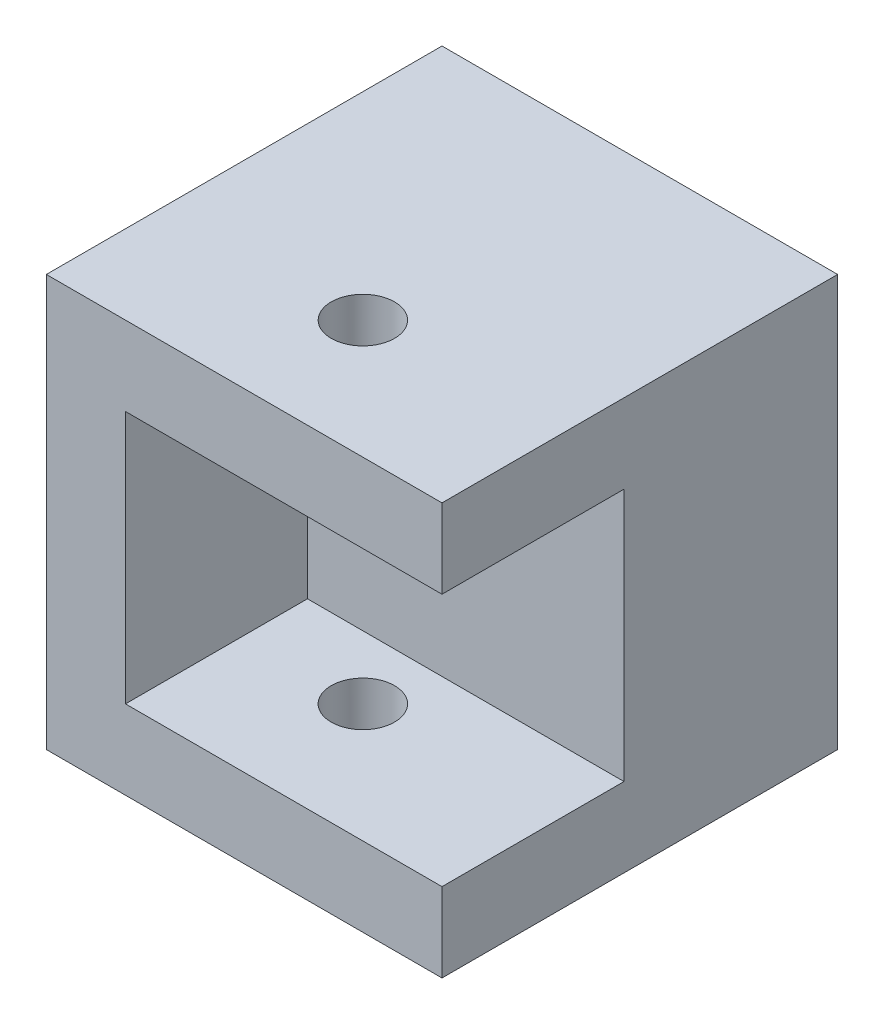
ISO-10303-21;
HEADER;
FILE_DESCRIPTION(('STEP AP214'),'2;1');
FILE_NAME('part.step','',(''),(''),'','','');
FILE_SCHEMA(('AUTOMOTIVE_DESIGN { 1 0 10303 214 1 1 1 1 }'));
ENDSEC;
DATA;
#1=APPLICATION_CONTEXT('core data for automotive mechanical design processes');
#2=APPLICATION_PROTOCOL_DEFINITION('international standard','automotive_design',2000,#1);
#3=PRODUCT_CONTEXT('',#1,'mechanical');
#4=PRODUCT('Part','Part','',(#3));
#5=PRODUCT_RELATED_PRODUCT_CATEGORY('part','',(#4));
#6=PRODUCT_DEFINITION_FORMATION('','',#4);
#7=PRODUCT_DEFINITION_CONTEXT('part definition',#1,'design');
#8=PRODUCT_DEFINITION('design','',#6,#7);
#9=PRODUCT_DEFINITION_SHAPE('','',#8);
#10=(LENGTH_UNIT() NAMED_UNIT(*) SI_UNIT(.MILLI.,.METRE.));
#11=(NAMED_UNIT(*) PLANE_ANGLE_UNIT() SI_UNIT($,.RADIAN.));
#12=(NAMED_UNIT(*) SI_UNIT($,.STERADIAN.) SOLID_ANGLE_UNIT());
#13=UNCERTAINTY_MEASURE_WITH_UNIT(LENGTH_MEASURE(1.E-05),#10,'distance_accuracy_value','');
#14=(GEOMETRIC_REPRESENTATION_CONTEXT(3) GLOBAL_UNCERTAINTY_ASSIGNED_CONTEXT((#13)) GLOBAL_UNIT_ASSIGNED_CONTEXT((#10,
#11,#12)) REPRESENTATION_CONTEXT('',''));
#15=CARTESIAN_POINT('',(0.,0.,0.));
#16=DIRECTION('',(0.,0.,1.));
#17=DIRECTION('',(1.,0.,0.));
#18=AXIS2_PLACEMENT_3D('',#15,#16,#17);
#19=CARTESIAN_POINT('',(7.70034407151723,28.7604472929724,21.5));
#20=DIRECTION('',(0.,-1.,0.));
#21=DIRECTION('',(1.,0.,0.));
#22=AXIS2_PLACEMENT_3D('',#19,#20,#21);
#23=CYLINDRICAL_SURFACE('',#22,2.);
#24=CARTESIAN_POINT('',(7.70034407151723,19.7604472929724,21.5));
#25=DIRECTION('',(0.,-1.,0.));
#26=DIRECTION('',(0.,0.,-1.));
#27=AXIS2_PLACEMENT_3D('',#24,#25,#26);
#28=CIRCLE('',#27,2.);
#29=CARTESIAN_POINT('',(7.70034407151723,19.7604472929724,19.5));
#30=VERTEX_POINT('',#29);
#31=EDGE_CURVE('E208',#30,#30,#28,.T.);
#32=ORIENTED_EDGE('',*,*,#31,.F.);
#33=EDGE_LOOP('',(#32));
#34=FACE_BOUND('',#33,.T.);
#35=CARTESIAN_POINT('',(7.70034407151723,14.7604472929724,21.5));
#36=DIRECTION('',(0.,-1.,0.));
#37=DIRECTION('',(1.,0.,0.));
#38=AXIS2_PLACEMENT_3D('',#35,#36,#37);
#39=CIRCLE('',#38,2.);
#40=CARTESIAN_POINT('',(9.70034407151723,14.7604472929724,21.5));
#41=VERTEX_POINT('',#40);
#42=EDGE_CURVE('E140',#41,#41,#39,.F.);
#43=ORIENTED_EDGE('',*,*,#42,.F.);
#44=EDGE_LOOP('',(#43));
#45=FACE_BOUND('',#44,.T.);
#46=ADVANCED_FACE('F44',(#34,#45),#23,.F.);
#47=CARTESIAN_POINT('',(-4.79965592848278,19.7604472929724,25.));
#48=DIRECTION('',(0.,-1.,0.));
#49=DIRECTION('',(0.,0.,-1.));
#50=AXIS2_PLACEMENT_3D('',#47,#48,#49);
#51=PLANE('',#50);
#52=ORIENTED_EDGE('',*,*,#31,.T.);
#53=EDGE_LOOP('',(#52));
#54=FACE_BOUND('',#53,.T.);
#55=DIRECTION('',(1.,0.,0.));
#56=VECTOR('',#55,1.);
#57=CARTESIAN_POINT('',(-31.1055488044146,19.7604472929724,3.99999999999998));
#58=LINE('',#57,#56);
#59=CARTESIAN_POINT('',(-4.79965592848278,19.7604472929724,3.99999999999998));
#60=VERTEX_POINT('',#59);
#61=CARTESIAN_POINT('',(20.2003440715172,19.7604472929724,3.99999999999998));
#62=VERTEX_POINT('',#61);
#63=EDGE_CURVE('E201',#60,#62,#58,.T.);
#64=ORIENTED_EDGE('',*,*,#63,.F.);
#65=DIRECTION('',(0.,0.,-1.));
#66=VECTOR('',#65,1.);
#67=CARTESIAN_POINT('',(-4.79965592848278,19.7604472929724,25.));
#68=LINE('',#67,#66);
#69=CARTESIAN_POINT('',(-4.79965592848278,19.7604472929724,29.));
#70=VERTEX_POINT('',#69);
#71=EDGE_CURVE('E13',#70,#60,#68,.T.);
#72=ORIENTED_EDGE('',*,*,#71,.F.);
#73=DIRECTION('',(-1.,0.,0.));
#74=VECTOR('',#73,1.);
#75=CARTESIAN_POINT('',(15.2003440715172,19.7604472929724,29.));
#76=LINE('',#75,#74);
#77=CARTESIAN_POINT('',(20.2003440715172,19.7604472929724,29.));
#78=VERTEX_POINT('',#77);
#79=EDGE_CURVE('E121',#78,#70,#76,.T.);
#80=ORIENTED_EDGE('',*,*,#79,.F.);
#81=DIRECTION('',(0.,0.,1.));
#82=VECTOR('',#81,1.);
#83=CARTESIAN_POINT('',(20.2003440715172,19.7604472929724,3.99999999999998));
#84=LINE('',#83,#82);
#85=EDGE_CURVE('E182',#62,#78,#84,.T.);
#86=ORIENTED_EDGE('',*,*,#85,.F.);
#87=EDGE_LOOP('',(#64,#72,#80,#86));
#88=FACE_BOUND('',#87,.T.);
#89=ADVANCED_FACE('F46',(#54,#88),#51,.F.);
#90=CARTESIAN_POINT('',(-4.79965592848278,-6.23955270702758,25.));
#91=DIRECTION('',(1.,0.,0.));
#92=DIRECTION('',(0.,1.,0.));
#93=AXIS2_PLACEMENT_3D('',#90,#91,#92);
#94=PLANE('',#93);
#95=DIRECTION('',(0.,-1.,0.));
#96=VECTOR('',#95,1.);
#97=CARTESIAN_POINT('',(-4.79965592848278,0.,4.));
#98=LINE('',#97,#96);
#99=CARTESIAN_POINT('',(-4.79965592848278,-6.2395527070276,3.99999999999998));
#100=VERTEX_POINT('',#99);
#101=EDGE_CURVE('E198',#60,#100,#98,.T.);
#102=ORIENTED_EDGE('',*,*,#101,.T.);
#103=DIRECTION('',(0.,0.,-1.));
#104=VECTOR('',#103,1.);
#105=CARTESIAN_POINT('',(-4.79965592848278,-6.23955270702758,25.));
#106=LINE('',#105,#104);
#107=CARTESIAN_POINT('',(-4.79965592848278,-6.23955270702758,29.));
#108=VERTEX_POINT('',#107);
#109=EDGE_CURVE('E52',#108,#100,#106,.T.);
#110=ORIENTED_EDGE('',*,*,#109,.F.);
#111=DIRECTION('',(0.,-1.,0.));
#112=VECTOR('',#111,1.);
#113=CARTESIAN_POINT('',(-4.79965592848278,19.7604472929724,29.));
#114=LINE('',#113,#112);
#115=EDGE_CURVE('E193',#70,#108,#114,.T.);
#116=ORIENTED_EDGE('',*,*,#115,.F.);
#117=ORIENTED_EDGE('',*,*,#71,.T.);
#118=EDGE_LOOP('',(#102,#110,#116,#117));
#119=FACE_BOUND('',#118,.T.);
#120=ADVANCED_FACE('F217',(#119),#94,.F.);
#121=CARTESIAN_POINT('',(-4.79965592848278,-6.23955270702758,25.));
#122=DIRECTION('',(0.,1.,0.));
#123=DIRECTION('',(0.,0.,1.));
#124=AXIS2_PLACEMENT_3D('',#121,#122,#123);
#125=PLANE('',#124);
#126=CARTESIAN_POINT('',(7.70034407151723,-6.23955270702758,21.5));
#127=DIRECTION('',(0.,1.,0.));
#128=DIRECTION('',(0.,0.,1.));
#129=AXIS2_PLACEMENT_3D('',#126,#127,#128);
#130=CIRCLE('',#129,2.);
#131=CARTESIAN_POINT('',(7.70034407151723,-6.23955270702758,23.5));
#132=VERTEX_POINT('',#131);
#133=EDGE_CURVE('E122',#132,#132,#130,.T.);
#134=ORIENTED_EDGE('',*,*,#133,.T.);
#135=EDGE_LOOP('',(#134));
#136=FACE_BOUND('',#135,.T.);
#137=DIRECTION('',(1.,0.,0.));
#138=VECTOR('',#137,1.);
#139=CARTESIAN_POINT('',(-31.1055488044146,-6.2395527070276,3.99999999999998));
#140=LINE('',#139,#138);
#141=CARTESIAN_POINT('',(20.2003440715172,-6.2395527070276,3.99999999999998));
#142=VERTEX_POINT('',#141);
#143=EDGE_CURVE('E67',#100,#142,#140,.T.);
#144=ORIENTED_EDGE('',*,*,#143,.T.);
#145=DIRECTION('',(0.,0.,-1.));
#146=VECTOR('',#145,1.);
#147=CARTESIAN_POINT('',(20.2003440715172,-6.23955270702758,29.));
#148=LINE('',#147,#146);
#149=CARTESIAN_POINT('',(20.2003440715172,-6.23955270702758,29.));
#150=VERTEX_POINT('',#149);
#151=EDGE_CURVE('E176',#150,#142,#148,.T.);
#152=ORIENTED_EDGE('',*,*,#151,.F.);
#153=DIRECTION('',(1.,0.,0.));
#154=VECTOR('',#153,1.);
#155=CARTESIAN_POINT('',(0.200344071517228,-6.23955270702758,29.));
#156=LINE('',#155,#154);
#157=EDGE_CURVE('E200',#108,#150,#156,.T.);
#158=ORIENTED_EDGE('',*,*,#157,.F.);
#159=ORIENTED_EDGE('',*,*,#109,.T.);
#160=EDGE_LOOP('',(#144,#152,#158,#159));
#161=FACE_BOUND('',#160,.T.);
#162=ADVANCED_FACE('F213',(#136,#161),#125,.F.);
#163=CARTESIAN_POINT('',(0.200344071517226,13.7604472929724,25.));
#164=DIRECTION('',(-1.,0.,0.));
#165=DIRECTION('',(0.,0.,1.));
#166=AXIS2_PLACEMENT_3D('',#163,#164,#165);
#167=PLANE('',#166);
#168=DIRECTION('',(0.,0.,-1.));
#169=VECTOR('',#168,1.);
#170=CARTESIAN_POINT('',(0.200344071517228,-1.23955270702759,29.));
#171=LINE('',#170,#169);
#172=CARTESIAN_POINT('',(0.200344071517228,-1.23955270702759,29.));
#173=VERTEX_POINT('',#172);
#174=CARTESIAN_POINT('',(0.200344071517228,-1.23955270702759,17.5));
#175=VERTEX_POINT('',#174);
#176=EDGE_CURVE('E206',#173,#175,#171,.T.);
#177=ORIENTED_EDGE('',*,*,#176,.T.);
#178=DIRECTION('',(0.,-1.,0.));
#179=VECTOR('',#178,1.);
#180=CARTESIAN_POINT('',(0.200344071517226,13.7604472929724,17.5));
#181=LINE('',#180,#179);
#182=CARTESIAN_POINT('',(0.200344071517228,14.7604472929724,17.5));
#183=VERTEX_POINT('',#182);
#184=EDGE_CURVE('E128',#183,#175,#181,.T.);
#185=ORIENTED_EDGE('',*,*,#184,.F.);
#186=DIRECTION('',(0.,0.,-1.));
#187=VECTOR('',#186,1.);
#188=CARTESIAN_POINT('',(0.200344071517228,14.7604472929724,29.));
#189=LINE('',#188,#187);
#190=CARTESIAN_POINT('',(0.200344071517228,14.7604472929724,29.));
#191=VERTEX_POINT('',#190);
#192=EDGE_CURVE('E125',#191,#183,#189,.T.);
#193=ORIENTED_EDGE('',*,*,#192,.F.);
#194=DIRECTION('',(0.,1.,0.));
#195=VECTOR('',#194,1.);
#196=CARTESIAN_POINT('',(0.200344071517228,-1.23955270702759,29.));
#197=LINE('',#196,#195);
#198=EDGE_CURVE('E110',#173,#191,#197,.T.);
#199=ORIENTED_EDGE('',*,*,#198,.F.);
#200=EDGE_LOOP('',(#177,#185,#193,#199));
#201=FACE_BOUND('',#200,.T.);
#202=ADVANCED_FACE('F126',(#201),#167,.F.);
#203=CARTESIAN_POINT('',(15.2003440715172,-1.23955270702759,29.));
#204=DIRECTION('',(0.,-1.,0.));
#205=DIRECTION('',(1.,0.,0.));
#206=AXIS2_PLACEMENT_3D('',#203,#204,#205);
#207=PLANE('',#206);
#208=CARTESIAN_POINT('',(7.70034407151723,-1.23955270702759,21.5));
#209=DIRECTION('',(0.,1.,0.));
#210=DIRECTION('',(-1.,0.,0.));
#211=AXIS2_PLACEMENT_3D('',#208,#209,#210);
#212=CIRCLE('',#211,2.);
#213=CARTESIAN_POINT('',(5.70034407151723,-1.23955270702759,21.5));
#214=VERTEX_POINT('',#213);
#215=EDGE_CURVE('E188',#214,#214,#212,.T.);
#216=ORIENTED_EDGE('',*,*,#215,.F.);
#217=EDGE_LOOP('',(#216));
#218=FACE_BOUND('',#217,.T.);
#219=DIRECTION('',(-1.,0.,0.));
#220=VECTOR('',#219,1.);
#221=CARTESIAN_POINT('',(15.2003440715172,-1.23955270702759,29.));
#222=LINE('',#221,#220);
#223=CARTESIAN_POINT('',(20.2003440715172,-1.23955270702759,29.));
#224=VERTEX_POINT('',#223);
#225=EDGE_CURVE('E118',#224,#173,#222,.T.);
#226=ORIENTED_EDGE('',*,*,#225,.F.);
#227=DIRECTION('',(0.,0.,1.));
#228=VECTOR('',#227,1.);
#229=CARTESIAN_POINT('',(20.2003440715172,-1.23955270702759,17.5));
#230=LINE('',#229,#228);
#231=CARTESIAN_POINT('',(20.2003440715172,-1.23955270702759,17.5));
#232=VERTEX_POINT('',#231);
#233=EDGE_CURVE('E170',#232,#224,#230,.T.);
#234=ORIENTED_EDGE('',*,*,#233,.F.);
#235=DIRECTION('',(1.,0.,0.));
#236=VECTOR('',#235,1.);
#237=CARTESIAN_POINT('',(0.200344071517228,-1.23955270702759,17.5));
#238=LINE('',#237,#236);
#239=EDGE_CURVE('E186',#175,#232,#238,.T.);
#240=ORIENTED_EDGE('',*,*,#239,.F.);
#241=ORIENTED_EDGE('',*,*,#176,.F.);
#242=EDGE_LOOP('',(#226,#234,#240,#241));
#243=FACE_BOUND('',#242,.T.);
#244=ADVANCED_FACE('F227',(#218,#243),#207,.F.);
#245=CARTESIAN_POINT('',(0.,0.,29.));
#246=DIRECTION('',(0.,0.,1.));
#247=DIRECTION('',(1.,0.,0.));
#248=AXIS2_PLACEMENT_3D('',#245,#246,#247);
#249=PLANE('',#248);
#250=ORIENTED_EDGE('',*,*,#198,.T.);
#251=DIRECTION('',(-1.,0.,0.));
#252=VECTOR('',#251,1.);
#253=CARTESIAN_POINT('',(20.2003440715172,14.7604472929724,29.));
#254=LINE('',#253,#252);
#255=CARTESIAN_POINT('',(20.2003440715172,14.7604472929724,29.));
#256=VERTEX_POINT('',#255);
#257=EDGE_CURVE('E115',#256,#191,#254,.T.);
#258=ORIENTED_EDGE('',*,*,#257,.F.);
#259=DIRECTION('',(0.,-1.,0.));
#260=VECTOR('',#259,1.);
#261=CARTESIAN_POINT('',(20.2003440715172,19.7604472929724,29.));
#262=LINE('',#261,#260);
#263=EDGE_CURVE('E165',#78,#256,#262,.T.);
#264=ORIENTED_EDGE('',*,*,#263,.F.);
#265=ORIENTED_EDGE('',*,*,#79,.T.);
#266=ORIENTED_EDGE('',*,*,#115,.T.);
#267=ORIENTED_EDGE('',*,*,#157,.T.);
#268=DIRECTION('',(0.,-1.,0.));
#269=VECTOR('',#268,1.);
#270=CARTESIAN_POINT('',(20.2003440715172,-1.23955270702759,29.));
#271=LINE('',#270,#269);
#272=EDGE_CURVE('E173',#224,#150,#271,.T.);
#273=ORIENTED_EDGE('',*,*,#272,.F.);
#274=ORIENTED_EDGE('',*,*,#225,.T.);
#275=EDGE_LOOP('',(#250,#258,#264,#265,#266,#267,#273,#274));
#276=FACE_BOUND('',#275,.T.);
#277=ADVANCED_FACE('F112',(#276),#249,.T.);
#278=CARTESIAN_POINT('',(-31.1055488044146,0.,4.));
#279=DIRECTION('',(0.,0.,-1.));
#280=DIRECTION('',(0.,1.,0.));
#281=AXIS2_PLACEMENT_3D('',#278,#279,#280);
#282=PLANE('',#281);
#283=CARTESIAN_POINT('',(14.7003440715172,13.7604472929724,4.));
#284=DIRECTION('',(0.,0.,-1.));
#285=DIRECTION('',(0.,1.,0.));
#286=AXIS2_PLACEMENT_3D('',#283,#284,#285);
#287=CIRCLE('',#286,2.);
#288=CARTESIAN_POINT('',(14.7003440715172,15.7604472929724,4.));
#289=VERTEX_POINT('',#288);
#290=EDGE_CURVE('E148',#289,#289,#287,.T.);
#291=ORIENTED_EDGE('',*,*,#290,.F.);
#292=EDGE_LOOP('',(#291));
#293=FACE_BOUND('',#292,.T.);
#294=CARTESIAN_POINT('',(0.700344071517225,13.7604472929724,4.));
#295=DIRECTION('',(0.,0.,-1.));
#296=DIRECTION('',(0.,1.,0.));
#297=AXIS2_PLACEMENT_3D('',#294,#295,#296);
#298=CIRCLE('',#297,2.);
#299=CARTESIAN_POINT('',(0.700344071517225,15.7604472929724,4.));
#300=VERTEX_POINT('',#299);
#301=EDGE_CURVE('E154',#300,#300,#298,.T.);
#302=ORIENTED_EDGE('',*,*,#301,.F.);
#303=EDGE_LOOP('',(#302));
#304=FACE_BOUND('',#303,.T.);
#305=CARTESIAN_POINT('',(0.700344071517225,-0.239552707027593,4.));
#306=DIRECTION('',(0.,0.,-1.));
#307=DIRECTION('',(0.,1.,0.));
#308=AXIS2_PLACEMENT_3D('',#305,#306,#307);
#309=CIRCLE('',#308,2.);
#310=CARTESIAN_POINT('',(0.700344071517225,1.76044729297241,4.));
#311=VERTEX_POINT('',#310);
#312=EDGE_CURVE('E143',#311,#311,#309,.T.);
#313=ORIENTED_EDGE('',*,*,#312,.F.);
#314=EDGE_LOOP('',(#313));
#315=FACE_BOUND('',#314,.T.);
#316=CARTESIAN_POINT('',(14.7003440715172,-0.239552707027593,4.));
#317=DIRECTION('',(0.,0.,-1.));
#318=DIRECTION('',(0.,1.,0.));
#319=AXIS2_PLACEMENT_3D('',#316,#317,#318);
#320=CIRCLE('',#319,2.);
#321=CARTESIAN_POINT('',(14.7003440715172,1.76044729297241,4.));
#322=VERTEX_POINT('',#321);
#323=EDGE_CURVE('E147',#322,#322,#320,.T.);
#324=ORIENTED_EDGE('',*,*,#323,.F.);
#325=EDGE_LOOP('',(#324));
#326=FACE_BOUND('',#325,.T.);
#327=ORIENTED_EDGE('',*,*,#63,.T.);
#328=DIRECTION('',(0.,1.,0.));
#329=VECTOR('',#328,1.);
#330=CARTESIAN_POINT('',(20.2003440715172,-6.2395527070276,3.99999999999998));
#331=LINE('',#330,#329);
#332=EDGE_CURVE('E179',#142,#62,#331,.T.);
#333=ORIENTED_EDGE('',*,*,#332,.F.);
#334=ORIENTED_EDGE('',*,*,#143,.F.);
#335=ORIENTED_EDGE('',*,*,#101,.F.);
#336=EDGE_LOOP('',(#327,#333,#334,#335));
#337=FACE_BOUND('',#336,.T.);
#338=ADVANCED_FACE('F219',(#293,#304,#315,#326,#337),#282,.T.);
#339=CARTESIAN_POINT('',(7.70034407151723,-11.2395527070276,21.5));
#340=DIRECTION('',(0.,1.,0.));
#341=DIRECTION('',(-1.,0.,0.));
#342=AXIS2_PLACEMENT_3D('',#339,#340,#341);
#343=CYLINDRICAL_SURFACE('',#342,2.);
#344=ORIENTED_EDGE('',*,*,#215,.T.);
#345=EDGE_LOOP('',(#344));
#346=FACE_BOUND('',#345,.T.);
#347=ORIENTED_EDGE('',*,*,#133,.F.);
#348=EDGE_LOOP('',(#347));
#349=FACE_BOUND('',#348,.T.);
#350=ADVANCED_FACE('F230',(#346,#349),#343,.F.);
#351=CARTESIAN_POINT('',(0.,0.,17.5));
#352=DIRECTION('',(0.,0.,1.));
#353=DIRECTION('',(1.,0.,0.));
#354=AXIS2_PLACEMENT_3D('',#351,#352,#353);
#355=PLANE('',#354);
#356=DIRECTION('',(0.,-1.,0.));
#357=VECTOR('',#356,1.);
#358=CARTESIAN_POINT('',(20.2003440715172,13.7604472929724,17.5));
#359=LINE('',#358,#357);
#360=CARTESIAN_POINT('',(20.2003440715172,14.7604472929724,17.5));
#361=VERTEX_POINT('',#360);
#362=EDGE_CURVE('E59',#361,#232,#359,.T.);
#363=ORIENTED_EDGE('',*,*,#362,.F.);
#364=DIRECTION('',(1.,0.,0.));
#365=VECTOR('',#364,1.);
#366=CARTESIAN_POINT('',(0.200344071517228,14.7604472929724,17.5));
#367=LINE('',#366,#365);
#368=EDGE_CURVE('E130',#183,#361,#367,.T.);
#369=ORIENTED_EDGE('',*,*,#368,.F.);
#370=ORIENTED_EDGE('',*,*,#184,.T.);
#371=ORIENTED_EDGE('',*,*,#239,.T.);
#372=EDGE_LOOP('',(#363,#369,#370,#371));
#373=FACE_BOUND('',#372,.T.);
#374=ADVANCED_FACE('F228',(#373),#355,.T.);
#375=CARTESIAN_POINT('',(20.2003440715172,0.,0.));
#376=DIRECTION('',(1.,0.,0.));
#377=DIRECTION('',(0.,0.,-1.));
#378=AXIS2_PLACEMENT_3D('',#375,#376,#377);
#379=PLANE('',#378);
#380=DIRECTION('',(0.,0.,1.));
#381=VECTOR('',#380,1.);
#382=CARTESIAN_POINT('',(20.2003440715172,14.7604472929724,17.5));
#383=LINE('',#382,#381);
#384=EDGE_CURVE('E135',#361,#256,#383,.T.);
#385=ORIENTED_EDGE('',*,*,#384,.F.);
#386=ORIENTED_EDGE('',*,*,#362,.T.);
#387=ORIENTED_EDGE('',*,*,#233,.T.);
#388=ORIENTED_EDGE('',*,*,#272,.T.);
#389=ORIENTED_EDGE('',*,*,#151,.T.);
#390=ORIENTED_EDGE('',*,*,#332,.T.);
#391=ORIENTED_EDGE('',*,*,#85,.T.);
#392=ORIENTED_EDGE('',*,*,#263,.T.);
#393=EDGE_LOOP('',(#385,#386,#387,#388,#389,#390,#391,#392));
#394=FACE_BOUND('',#393,.T.);
#395=ADVANCED_FACE('F223',(#394),#379,.T.);
#396=CARTESIAN_POINT('',(14.7003440715172,-0.239552707027593,14.));
#397=DIRECTION('',(0.,0.,-1.));
#398=DIRECTION('',(0.,1.,0.));
#399=AXIS2_PLACEMENT_3D('',#396,#397,#398);
#400=CYLINDRICAL_SURFACE('',#399,2.);
#401=CARTESIAN_POINT('',(14.7003440715172,-0.239552707027593,14.));
#402=DIRECTION('',(0.,0.,-1.));
#403=DIRECTION('',(0.,1.,0.));
#404=AXIS2_PLACEMENT_3D('',#401,#402,#403);
#405=CIRCLE('',#404,2.);
#406=CARTESIAN_POINT('',(14.7003440715172,1.76044729297241,14.));
#407=VERTEX_POINT('',#406);
#408=EDGE_CURVE('E162',#407,#407,#405,.T.);
#409=ORIENTED_EDGE('',*,*,#408,.F.);
#410=EDGE_LOOP('',(#409));
#411=FACE_BOUND('',#410,.T.);
#412=ORIENTED_EDGE('',*,*,#323,.T.);
#413=EDGE_LOOP('',(#412));
#414=FACE_BOUND('',#413,.T.);
#415=ADVANCED_FACE('F237',(#411,#414),#400,.F.);
#416=CARTESIAN_POINT('',(14.7003440715172,-0.239552707027593,14.));
#417=DIRECTION('',(0.,0.,-1.));
#418=DIRECTION('',(0.,1.,0.));
#419=AXIS2_PLACEMENT_3D('',#416,#417,#418);
#420=PLANE('',#419);
#421=ORIENTED_EDGE('',*,*,#408,.T.);
#422=EDGE_LOOP('',(#421));
#423=FACE_BOUND('',#422,.T.);
#424=ADVANCED_FACE('F309',(#423),#420,.T.);
#425=CARTESIAN_POINT('',(0.700344071517225,-0.239552707027593,14.));
#426=DIRECTION('',(0.,0.,-1.));
#427=DIRECTION('',(0.,1.,0.));
#428=AXIS2_PLACEMENT_3D('',#425,#426,#427);
#429=CYLINDRICAL_SURFACE('',#428,2.);
#430=CARTESIAN_POINT('',(0.700344071517225,-0.239552707027593,14.));
#431=DIRECTION('',(0.,0.,-1.));
#432=DIRECTION('',(0.,1.,0.));
#433=AXIS2_PLACEMENT_3D('',#430,#431,#432);
#434=CIRCLE('',#433,2.);
#435=CARTESIAN_POINT('',(0.700344071517225,1.76044729297241,14.));
#436=VERTEX_POINT('',#435);
#437=EDGE_CURVE('E157',#436,#436,#434,.T.);
#438=ORIENTED_EDGE('',*,*,#437,.F.);
#439=EDGE_LOOP('',(#438));
#440=FACE_BOUND('',#439,.T.);
#441=ORIENTED_EDGE('',*,*,#312,.T.);
#442=EDGE_LOOP('',(#441));
#443=FACE_BOUND('',#442,.T.);
#444=ADVANCED_FACE('F317',(#440,#443),#429,.F.);
#445=CARTESIAN_POINT('',(0.700344071517225,-0.239552707027593,14.));
#446=DIRECTION('',(0.,0.,-1.));
#447=DIRECTION('',(0.,1.,0.));
#448=AXIS2_PLACEMENT_3D('',#445,#446,#447);
#449=PLANE('',#448);
#450=ORIENTED_EDGE('',*,*,#437,.T.);
#451=EDGE_LOOP('',(#450));
#452=FACE_BOUND('',#451,.T.);
#453=ADVANCED_FACE('F325',(#452),#449,.T.);
#454=CARTESIAN_POINT('',(0.700344071517225,13.7604472929724,14.));
#455=DIRECTION('',(0.,0.,-1.));
#456=DIRECTION('',(0.,1.,0.));
#457=AXIS2_PLACEMENT_3D('',#454,#455,#456);
#458=CYLINDRICAL_SURFACE('',#457,2.);
#459=CARTESIAN_POINT('',(0.700344071517225,13.7604472929724,14.));
#460=DIRECTION('',(0.,0.,-1.));
#461=DIRECTION('',(0.,1.,0.));
#462=AXIS2_PLACEMENT_3D('',#459,#460,#461);
#463=CIRCLE('',#462,2.);
#464=CARTESIAN_POINT('',(0.700344071517225,15.7604472929724,14.));
#465=VERTEX_POINT('',#464);
#466=EDGE_CURVE('E151',#465,#465,#463,.T.);
#467=ORIENTED_EDGE('',*,*,#466,.F.);
#468=EDGE_LOOP('',(#467));
#469=FACE_BOUND('',#468,.T.);
#470=ORIENTED_EDGE('',*,*,#301,.T.);
#471=EDGE_LOOP('',(#470));
#472=FACE_BOUND('',#471,.T.);
#473=ADVANCED_FACE('F333',(#469,#472),#458,.F.);
#474=CARTESIAN_POINT('',(0.700344071517225,13.7604472929724,14.));
#475=DIRECTION('',(0.,0.,-1.));
#476=DIRECTION('',(0.,1.,0.));
#477=AXIS2_PLACEMENT_3D('',#474,#475,#476);
#478=PLANE('',#477);
#479=ORIENTED_EDGE('',*,*,#466,.T.);
#480=EDGE_LOOP('',(#479));
#481=FACE_BOUND('',#480,.T.);
#482=ADVANCED_FACE('F341',(#481),#478,.T.);
#483=CARTESIAN_POINT('',(14.7003440715172,13.7604472929724,14.));
#484=DIRECTION('',(0.,0.,-1.));
#485=DIRECTION('',(0.,1.,0.));
#486=AXIS2_PLACEMENT_3D('',#483,#484,#485);
#487=CYLINDRICAL_SURFACE('',#486,2.);
#488=CARTESIAN_POINT('',(14.7003440715172,13.7604472929724,14.));
#489=DIRECTION('',(0.,0.,-1.));
#490=DIRECTION('',(0.,1.,0.));
#491=AXIS2_PLACEMENT_3D('',#488,#489,#490);
#492=CIRCLE('',#491,2.);
#493=CARTESIAN_POINT('',(14.7003440715172,15.7604472929724,14.));
#494=VERTEX_POINT('',#493);
#495=EDGE_CURVE('E144',#494,#494,#492,.T.);
#496=ORIENTED_EDGE('',*,*,#495,.F.);
#497=EDGE_LOOP('',(#496));
#498=FACE_BOUND('',#497,.T.);
#499=ORIENTED_EDGE('',*,*,#290,.T.);
#500=EDGE_LOOP('',(#499));
#501=FACE_BOUND('',#500,.T.);
#502=ADVANCED_FACE('F349',(#498,#501),#487,.F.);
#503=CARTESIAN_POINT('',(14.7003440715172,13.7604472929724,14.));
#504=DIRECTION('',(0.,0.,-1.));
#505=DIRECTION('',(0.,1.,0.));
#506=AXIS2_PLACEMENT_3D('',#503,#504,#505);
#507=PLANE('',#506);
#508=ORIENTED_EDGE('',*,*,#495,.T.);
#509=EDGE_LOOP('',(#508));
#510=FACE_BOUND('',#509,.T.);
#511=ADVANCED_FACE('F357',(#510),#507,.T.);
#512=CARTESIAN_POINT('',(0.,14.7604472929724,0.));
#513=DIRECTION('',(0.,-1.,0.));
#514=DIRECTION('',(1.,0.,0.));
#515=AXIS2_PLACEMENT_3D('',#512,#513,#514);
#516=PLANE('',#515);
#517=ORIENTED_EDGE('',*,*,#257,.T.);
#518=ORIENTED_EDGE('',*,*,#192,.T.);
#519=ORIENTED_EDGE('',*,*,#368,.T.);
#520=ORIENTED_EDGE('',*,*,#384,.T.);
#521=EDGE_LOOP('',(#517,#518,#519,#520));
#522=FACE_BOUND('',#521,.T.);
#523=ORIENTED_EDGE('',*,*,#42,.T.);
#524=EDGE_LOOP('',(#523));
#525=FACE_BOUND('',#524,.T.);
#526=ADVANCED_FACE('F132',(#522,#525),#516,.T.);
#527=CLOSED_SHELL('',(#46,#89,#120,#162,#202,#244,#277,#338,#350,#374,#395,#415,#424,#444,#453,
#473,#482,#502,#511,#526));
#528=MANIFOLD_SOLID_BREP('B2',#527);
#529=ADVANCED_BREP_SHAPE_REPRESENTATION('',(#18,#528),#14);
#530=SHAPE_DEFINITION_REPRESENTATION(#9,#529);
ENDSEC;
END-ISO-10303-21;
